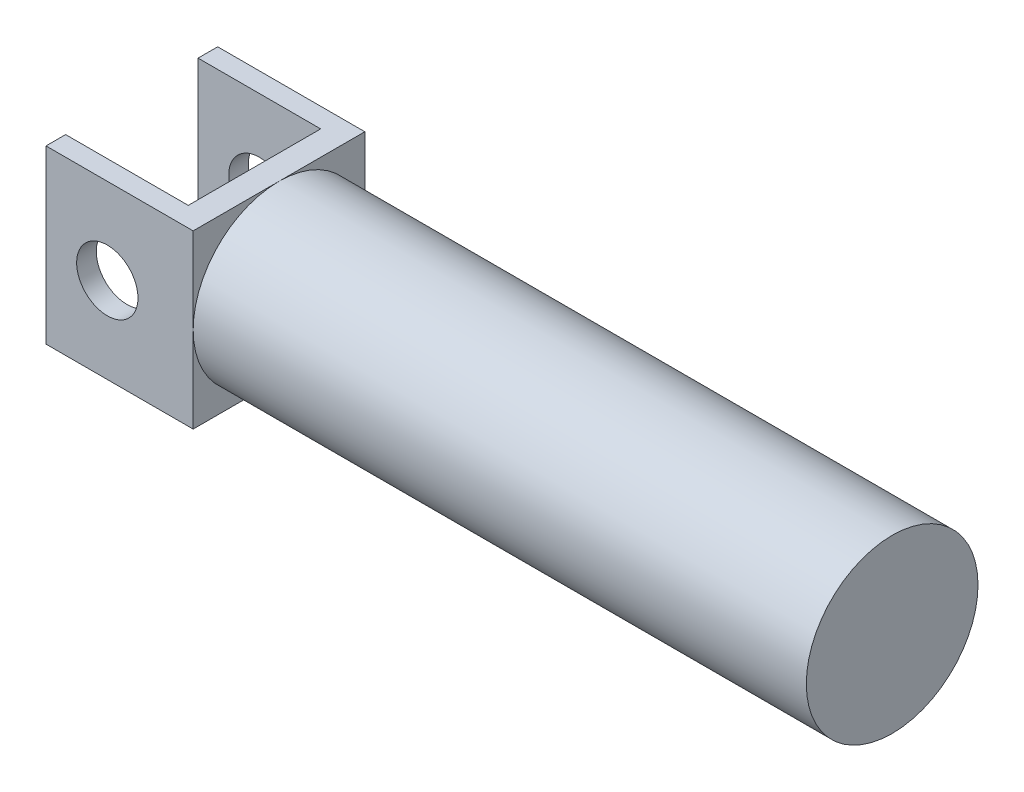
ISO-10303-21;
HEADER;
FILE_DESCRIPTION(('STEP AP214'),'2;1');
FILE_NAME('part.step','',(''),(''),'','','');
FILE_SCHEMA(('AUTOMOTIVE_DESIGN { 1 0 10303 214 1 1 1 1 }'));
ENDSEC;
DATA;
#1=APPLICATION_CONTEXT('core data for automotive mechanical design processes');
#2=APPLICATION_PROTOCOL_DEFINITION('international standard','automotive_design',2000,#1);
#3=PRODUCT_CONTEXT('',#1,'mechanical');
#4=PRODUCT('Part','Part','',(#3));
#5=PRODUCT_RELATED_PRODUCT_CATEGORY('part','',(#4));
#6=PRODUCT_DEFINITION_FORMATION('','',#4);
#7=PRODUCT_DEFINITION_CONTEXT('part definition',#1,'design');
#8=PRODUCT_DEFINITION('design','',#6,#7);
#9=PRODUCT_DEFINITION_SHAPE('','',#8);
#10=(LENGTH_UNIT() NAMED_UNIT(*) SI_UNIT(.MILLI.,.METRE.));
#11=(NAMED_UNIT(*) PLANE_ANGLE_UNIT() SI_UNIT($,.RADIAN.));
#12=(NAMED_UNIT(*) SI_UNIT($,.STERADIAN.) SOLID_ANGLE_UNIT());
#13=UNCERTAINTY_MEASURE_WITH_UNIT(LENGTH_MEASURE(1.E-05),#10,'distance_accuracy_value','');
#14=(GEOMETRIC_REPRESENTATION_CONTEXT(3) GLOBAL_UNCERTAINTY_ASSIGNED_CONTEXT((#13)) GLOBAL_UNIT_ASSIGNED_CONTEXT((#10,
#11,#12)) REPRESENTATION_CONTEXT('',''));
#15=CARTESIAN_POINT('',(0.,0.,0.));
#16=DIRECTION('',(0.,0.,1.));
#17=DIRECTION('',(1.,0.,0.));
#18=AXIS2_PLACEMENT_3D('',#15,#16,#17);
#19=CARTESIAN_POINT('',(0.,0.,0.));
#20=DIRECTION('',(1.,0.,0.));
#21=DIRECTION('',(0.,0.,-1.));
#22=AXIS2_PLACEMENT_3D('',#19,#20,#21);
#23=PLANE('',#22);
#24=DIRECTION('',(0.,-1.,0.));
#25=VECTOR('',#24,1.);
#26=CARTESIAN_POINT('',(0.,8.89000000000006,6.85799999999999));
#27=LINE('',#26,#25);
#28=CARTESIAN_POINT('',(0.,8.89000000000006,6.85799999999998));
#29=VERTEX_POINT('',#28);
#30=CARTESIAN_POINT('',(0.,-8.88999999999995,6.85799999999998));
#31=VERTEX_POINT('',#30);
#32=EDGE_CURVE('E69',#29,#31,#27,.T.);
#33=ORIENTED_EDGE('',*,*,#32,.F.);
#34=DIRECTION('',(0.,0.,1.));
#35=VECTOR('',#34,1.);
#36=CARTESIAN_POINT('',(0.,8.89000000000006,8.89000000000008));
#37=LINE('',#36,#35);
#38=CARTESIAN_POINT('',(0.,8.89000000000006,-6.85799999999999));
#39=VERTEX_POINT('',#38);
#40=EDGE_CURVE('E149',#39,#29,#37,.T.);
#41=ORIENTED_EDGE('',*,*,#40,.F.);
#42=DIRECTION('',(0.,1.,0.));
#43=VECTOR('',#42,1.);
#44=CARTESIAN_POINT('',(0.,8.89000000000006,-6.85799999999999));
#45=LINE('',#44,#43);
#46=CARTESIAN_POINT('',(0.,-8.89000000000005,-6.85799999999998));
#47=VERTEX_POINT('',#46);
#48=EDGE_CURVE('E64',#47,#39,#45,.T.);
#49=ORIENTED_EDGE('',*,*,#48,.F.);
#50=DIRECTION('',(0.,0.,-1.));
#51=VECTOR('',#50,1.);
#52=CARTESIAN_POINT('',(0.,-8.88999999999995,8.89000000000008));
#53=LINE('',#52,#51);
#54=EDGE_CURVE('E209',#31,#47,#53,.T.);
#55=ORIENTED_EDGE('',*,*,#54,.F.);
#56=EDGE_LOOP('',(#33,#41,#49,#55));
#57=FACE_BOUND('',#56,.T.);
#58=ADVANCED_FACE('F45',(#57),#23,.F.);
#59=CARTESIAN_POINT('',(2.54,0.,0.));
#60=DIRECTION('',(1.,0.,0.));
#61=DIRECTION('',(0.,0.,-1.));
#62=AXIS2_PLACEMENT_3D('',#59,#60,#61);
#63=PLANE('',#62);
#64=CARTESIAN_POINT('',(2.54,0.,0.));
#65=DIRECTION('',(1.,0.,0.));
#66=DIRECTION('',(0.,0.,-1.));
#67=AXIS2_PLACEMENT_3D('',#64,#65,#66);
#68=CIRCLE('',#67,8.89000000000001);
#69=CARTESIAN_POINT('',(2.54,0.,-8.89000000000001));
#70=VERTEX_POINT('',#69);
#71=CARTESIAN_POINT('',(2.54,8.89000000000006,0.));
#72=VERTEX_POINT('',#71);
#73=EDGE_CURVE('E57',#70,#72,#68,.T.);
#74=ORIENTED_EDGE('',*,*,#73,.F.);
#75=DIRECTION('',(0.,1.,0.));
#76=VECTOR('',#75,1.);
#77=CARTESIAN_POINT('',(2.54,-8.89000000000006,-8.88999999999992));
#78=LINE('',#77,#76);
#79=CARTESIAN_POINT('',(2.54,8.89000000000006,-8.88999999999992));
#80=VERTEX_POINT('',#79);
#81=EDGE_CURVE('E202',#70,#80,#78,.T.);
#82=ORIENTED_EDGE('',*,*,#81,.T.);
#83=DIRECTION('',(0.,0.,1.));
#84=VECTOR('',#83,1.);
#85=CARTESIAN_POINT('',(2.54,8.89000000000006,8.89000000000008));
#86=LINE('',#85,#84);
#87=EDGE_CURVE('E187',#80,#72,#86,.T.);
#88=ORIENTED_EDGE('',*,*,#87,.T.);
#89=EDGE_LOOP('',(#74,#82,#88));
#90=FACE_BOUND('',#89,.T.);
#91=ADVANCED_FACE('F247',(#90),#63,.T.);
#92=CARTESIAN_POINT('',(2.54,0.,8.89000000000008));
#93=VERTEX_POINT('',#92);
#94=EDGE_CURVE('E11',#72,#93,#68,.T.);
#95=ORIENTED_EDGE('',*,*,#94,.F.);
#96=CARTESIAN_POINT('',(2.54,8.89000000000006,8.89000000000008));
#97=VERTEX_POINT('',#96);
#98=EDGE_CURVE('E192',#72,#97,#86,.T.);
#99=ORIENTED_EDGE('',*,*,#98,.T.);
#100=DIRECTION('',(0.,-1.,0.));
#101=VECTOR('',#100,1.);
#102=CARTESIAN_POINT('',(2.54,-8.88999999999995,8.89000000000008));
#103=LINE('',#102,#101);
#104=EDGE_CURVE('E193',#97,#93,#103,.T.);
#105=ORIENTED_EDGE('',*,*,#104,.T.);
#106=EDGE_LOOP('',(#95,#99,#105));
#107=FACE_BOUND('',#106,.T.);
#108=ADVANCED_FACE('F237',(#107),#63,.T.);
#109=CARTESIAN_POINT('',(2.54,-8.89000000000001,0.));
#110=VERTEX_POINT('',#109);
#111=EDGE_CURVE('E55',#93,#110,#68,.T.);
#112=ORIENTED_EDGE('',*,*,#111,.F.);
#113=CARTESIAN_POINT('',(2.54,-8.88999999999995,8.89000000000008));
#114=VERTEX_POINT('',#113);
#115=EDGE_CURVE('E191',#93,#114,#103,.T.);
#116=ORIENTED_EDGE('',*,*,#115,.T.);
#117=DIRECTION('',(0.,0.,-1.));
#118=VECTOR('',#117,1.);
#119=CARTESIAN_POINT('',(2.54,-8.88999999999995,8.89000000000008));
#120=LINE('',#119,#118);
#121=EDGE_CURVE('E198',#114,#110,#120,.T.);
#122=ORIENTED_EDGE('',*,*,#121,.T.);
#123=EDGE_LOOP('',(#112,#116,#122));
#124=FACE_BOUND('',#123,.T.);
#125=ADVANCED_FACE('F231',(#124),#63,.T.);
#126=CARTESIAN_POINT('',(2.54,8.89000000000006,8.89000000000008));
#127=DIRECTION('',(0.,-1.,0.));
#128=DIRECTION('',(0.,0.,-1.));
#129=AXIS2_PLACEMENT_3D('',#126,#127,#128);
#130=PLANE('',#129);
#131=DIRECTION('',(-1.,0.,0.));
#132=VECTOR('',#131,1.);
#133=CARTESIAN_POINT('',(2.54,8.89000000000006,-8.88999999999992));
#134=LINE('',#133,#132);
#135=CARTESIAN_POINT('',(-12.7,8.89000000000006,-8.89000000000006));
#136=VERTEX_POINT('',#135);
#137=EDGE_CURVE('E206',#80,#136,#134,.T.);
#138=ORIENTED_EDGE('',*,*,#137,.T.);
#139=DIRECTION('',(0.,0.,-1.));
#140=VECTOR('',#139,1.);
#141=CARTESIAN_POINT('',(-12.7,8.89000000000006,-8.89000000000006));
#142=LINE('',#141,#140);
#143=CARTESIAN_POINT('',(-12.7,8.89000000000006,-6.85799999999999));
#144=VERTEX_POINT('',#143);
#145=EDGE_CURVE('E171',#144,#136,#142,.T.);
#146=ORIENTED_EDGE('',*,*,#145,.F.);
#147=DIRECTION('',(1.,0.,0.));
#148=VECTOR('',#147,1.);
#149=CARTESIAN_POINT('',(-12.7,8.89000000000006,-6.85799999999999));
#150=LINE('',#149,#148);
#151=EDGE_CURVE('E164',#144,#39,#150,.T.);
#152=ORIENTED_EDGE('',*,*,#151,.T.);
#153=ORIENTED_EDGE('',*,*,#40,.T.);
#154=DIRECTION('',(1.,0.,0.));
#155=VECTOR('',#154,1.);
#156=CARTESIAN_POINT('',(-12.7,8.89000000000006,6.85799999999999));
#157=LINE('',#156,#155);
#158=CARTESIAN_POINT('',(-12.7,8.89000000000006,6.85799999999999));
#159=VERTEX_POINT('',#158);
#160=EDGE_CURVE('E129',#159,#29,#157,.T.);
#161=ORIENTED_EDGE('',*,*,#160,.F.);
#162=DIRECTION('',(0.,0.,-1.));
#163=VECTOR('',#162,1.);
#164=CARTESIAN_POINT('',(-12.7,8.89000000000006,8.89000000000006));
#165=LINE('',#164,#163);
#166=CARTESIAN_POINT('',(-12.7,8.89000000000006,8.89000000000006));
#167=VERTEX_POINT('',#166);
#168=EDGE_CURVE('E137',#167,#159,#165,.T.);
#169=ORIENTED_EDGE('',*,*,#168,.F.);
#170=DIRECTION('',(-1.,0.,0.));
#171=VECTOR('',#170,1.);
#172=CARTESIAN_POINT('',(2.54,8.89000000000006,8.89000000000008));
#173=LINE('',#172,#171);
#174=EDGE_CURVE('E219',#97,#167,#173,.T.);
#175=ORIENTED_EDGE('',*,*,#174,.F.);
#176=ORIENTED_EDGE('',*,*,#98,.F.);
#177=ORIENTED_EDGE('',*,*,#87,.F.);
#178=EDGE_LOOP('',(#138,#146,#152,#153,#161,#169,#175,#176,#177));
#179=FACE_BOUND('',#178,.T.);
#180=ADVANCED_FACE('F47',(#179),#130,.F.);
#181=CARTESIAN_POINT('',(2.54,-8.88999999999995,8.89000000000008));
#182=DIRECTION('',(0.,0.,-1.));
#183=DIRECTION('',(-1.,0.,0.));
#184=AXIS2_PLACEMENT_3D('',#181,#182,#183);
#185=PLANE('',#184);
#186=CARTESIAN_POINT('',(-6.35,0.,8.89000000000008));
#187=DIRECTION('',(0.,0.,1.));
#188=DIRECTION('',(1.,0.,0.));
#189=AXIS2_PLACEMENT_3D('',#186,#187,#188);
#190=CIRCLE('',#189,3.175);
#191=CARTESIAN_POINT('',(-3.175,0.,8.89000000000008));
#192=VERTEX_POINT('',#191);
#193=EDGE_CURVE('E273',#192,#192,#190,.T.);
#194=ORIENTED_EDGE('',*,*,#193,.F.);
#195=EDGE_LOOP('',(#194));
#196=FACE_BOUND('',#195,.T.);
#197=ORIENTED_EDGE('',*,*,#174,.T.);
#198=DIRECTION('',(0.,1.,0.));
#199=VECTOR('',#198,1.);
#200=CARTESIAN_POINT('',(-12.7,8.89000000000006,8.89000000000006));
#201=LINE('',#200,#199);
#202=CARTESIAN_POINT('',(-12.7,-8.88999999999995,8.89000000000006));
#203=VERTEX_POINT('',#202);
#204=EDGE_CURVE('E143',#203,#167,#201,.T.);
#205=ORIENTED_EDGE('',*,*,#204,.F.);
#206=DIRECTION('',(-1.,0.,0.));
#207=VECTOR('',#206,1.);
#208=CARTESIAN_POINT('',(2.54,-8.88999999999995,8.89000000000008));
#209=LINE('',#208,#207);
#210=EDGE_CURVE('E217',#114,#203,#209,.T.);
#211=ORIENTED_EDGE('',*,*,#210,.F.);
#212=ORIENTED_EDGE('',*,*,#115,.F.);
#213=ORIENTED_EDGE('',*,*,#104,.F.);
#214=EDGE_LOOP('',(#197,#205,#211,#212,#213));
#215=FACE_BOUND('',#214,.T.);
#216=ADVANCED_FACE('F234',(#196,#215),#185,.F.);
#217=CARTESIAN_POINT('',(2.54,-8.88999999999995,8.89000000000008));
#218=DIRECTION('',(0.,1.,0.));
#219=DIRECTION('',(0.,0.,1.));
#220=AXIS2_PLACEMENT_3D('',#217,#218,#219);
#221=PLANE('',#220);
#222=ORIENTED_EDGE('',*,*,#210,.T.);
#223=DIRECTION('',(0.,0.,1.));
#224=VECTOR('',#223,1.);
#225=CARTESIAN_POINT('',(-12.7,-8.88999999999995,8.89000000000006));
#226=LINE('',#225,#224);
#227=CARTESIAN_POINT('',(-12.7,-8.88999999999995,6.85799999999998));
#228=VERTEX_POINT('',#227);
#229=EDGE_CURVE('E136',#228,#203,#226,.T.);
#230=ORIENTED_EDGE('',*,*,#229,.F.);
#231=DIRECTION('',(1.,0.,0.));
#232=VECTOR('',#231,1.);
#233=CARTESIAN_POINT('',(-12.7,-8.88999999999995,6.85799999999998));
#234=LINE('',#233,#232);
#235=EDGE_CURVE('E131',#228,#31,#234,.T.);
#236=ORIENTED_EDGE('',*,*,#235,.T.);
#237=ORIENTED_EDGE('',*,*,#54,.T.);
#238=DIRECTION('',(1.,0.,0.));
#239=VECTOR('',#238,1.);
#240=CARTESIAN_POINT('',(-12.7,-8.88999999999995,-6.85799999999998));
#241=LINE('',#240,#239);
#242=CARTESIAN_POINT('',(-12.7,-8.88999999999995,-6.85799999999998));
#243=VERTEX_POINT('',#242);
#244=EDGE_CURVE('E160',#243,#47,#241,.T.);
#245=ORIENTED_EDGE('',*,*,#244,.F.);
#246=DIRECTION('',(0.,0.,1.));
#247=VECTOR('',#246,1.);
#248=CARTESIAN_POINT('',(-12.7,-8.88999999999995,-8.89000000000006));
#249=LINE('',#248,#247);
#250=CARTESIAN_POINT('',(-12.7,-8.88999999999995,-8.89000000000006));
#251=VERTEX_POINT('',#250);
#252=EDGE_CURVE('E174',#251,#243,#249,.T.);
#253=ORIENTED_EDGE('',*,*,#252,.F.);
#254=DIRECTION('',(-1.,0.,0.));
#255=VECTOR('',#254,1.);
#256=CARTESIAN_POINT('',(2.54,-8.89000000000006,-8.88999999999992));
#257=LINE('',#256,#255);
#258=CARTESIAN_POINT('',(2.54,-8.89000000000006,-8.88999999999992));
#259=VERTEX_POINT('',#258);
#260=EDGE_CURVE('E214',#259,#251,#257,.T.);
#261=ORIENTED_EDGE('',*,*,#260,.F.);
#262=EDGE_CURVE('E197',#110,#259,#120,.T.);
#263=ORIENTED_EDGE('',*,*,#262,.F.);
#264=ORIENTED_EDGE('',*,*,#121,.F.);
#265=EDGE_LOOP('',(#222,#230,#236,#237,#245,#253,#261,#263,#264));
#266=FACE_BOUND('',#265,.T.);
#267=ADVANCED_FACE('F262',(#266),#221,.F.);
#268=CARTESIAN_POINT('',(2.54,-8.89000000000006,-8.88999999999992));
#269=DIRECTION('',(0.,0.,1.));
#270=DIRECTION('',(1.,0.,0.));
#271=AXIS2_PLACEMENT_3D('',#268,#269,#270);
#272=PLANE('',#271);
#273=CARTESIAN_POINT('',(-6.35,0.,-8.89000000000006));
#274=DIRECTION('',(0.,0.,1.));
#275=DIRECTION('',(1.,0.,0.));
#276=AXIS2_PLACEMENT_3D('',#273,#274,#275);
#277=CIRCLE('',#276,3.175);
#278=CARTESIAN_POINT('',(-3.175,0.,-8.89000000000006));
#279=VERTEX_POINT('',#278);
#280=EDGE_CURVE('E277',#279,#279,#277,.T.);
#281=ORIENTED_EDGE('',*,*,#280,.T.);
#282=EDGE_LOOP('',(#281));
#283=FACE_BOUND('',#282,.T.);
#284=ORIENTED_EDGE('',*,*,#260,.T.);
#285=DIRECTION('',(0.,-1.,0.));
#286=VECTOR('',#285,1.);
#287=CARTESIAN_POINT('',(-12.7,8.89000000000006,-8.89000000000006));
#288=LINE('',#287,#286);
#289=EDGE_CURVE('E177',#136,#251,#288,.T.);
#290=ORIENTED_EDGE('',*,*,#289,.F.);
#291=ORIENTED_EDGE('',*,*,#137,.F.);
#292=ORIENTED_EDGE('',*,*,#81,.F.);
#293=EDGE_CURVE('E203',#259,#70,#78,.T.);
#294=ORIENTED_EDGE('',*,*,#293,.F.);
#295=EDGE_LOOP('',(#284,#290,#291,#292,#294));
#296=FACE_BOUND('',#295,.T.);
#297=ADVANCED_FACE('F251',(#283,#296),#272,.F.);
#298=EDGE_CURVE('E156',#110,#70,#68,.T.);
#299=ORIENTED_EDGE('',*,*,#298,.F.);
#300=ORIENTED_EDGE('',*,*,#262,.T.);
#301=ORIENTED_EDGE('',*,*,#293,.T.);
#302=EDGE_LOOP('',(#299,#300,#301));
#303=FACE_BOUND('',#302,.T.);
#304=ADVANCED_FACE('F307',(#303),#63,.T.);
#305=CARTESIAN_POINT('',(66.04,0.,0.));
#306=DIRECTION('',(-1.,0.,0.));
#307=DIRECTION('',(0.,0.,1.));
#308=AXIS2_PLACEMENT_3D('',#305,#306,#307);
#309=CYLINDRICAL_SURFACE('',#308,8.89000000000001);
#310=CARTESIAN_POINT('',(66.04,0.,0.));
#311=DIRECTION('',(1.,0.,0.));
#312=DIRECTION('',(0.,0.,-1.));
#313=AXIS2_PLACEMENT_3D('',#310,#311,#312);
#314=CIRCLE('',#313,8.89000000000001);
#315=CARTESIAN_POINT('',(66.04,0.,-8.89000000000001));
#316=VERTEX_POINT('',#315);
#317=EDGE_CURVE('E155',#316,#316,#314,.T.);
#318=ORIENTED_EDGE('',*,*,#317,.F.);
#319=EDGE_LOOP('',(#318));
#320=FACE_BOUND('',#319,.T.);
#321=ORIENTED_EDGE('',*,*,#73,.T.);
#322=ORIENTED_EDGE('',*,*,#94,.T.);
#323=ORIENTED_EDGE('',*,*,#111,.T.);
#324=ORIENTED_EDGE('',*,*,#298,.T.);
#325=EDGE_LOOP('',(#321,#322,#323,#324));
#326=FACE_BOUND('',#325,.T.);
#327=ADVANCED_FACE('F228',(#320,#326),#309,.T.);
#328=CARTESIAN_POINT('',(66.04,0.,0.));
#329=DIRECTION('',(1.,0.,0.));
#330=DIRECTION('',(0.,0.,-1.));
#331=AXIS2_PLACEMENT_3D('',#328,#329,#330);
#332=PLANE('',#331);
#333=ORIENTED_EDGE('',*,*,#317,.T.);
#334=EDGE_LOOP('',(#333));
#335=FACE_BOUND('',#334,.T.);
#336=ADVANCED_FACE('F329',(#335),#332,.T.);
#337=CARTESIAN_POINT('',(-12.7,8.89000000000006,-6.85799999999999));
#338=DIRECTION('',(0.,0.,-1.));
#339=DIRECTION('',(0.,1.,0.));
#340=AXIS2_PLACEMENT_3D('',#337,#338,#339);
#341=PLANE('',#340);
#342=CARTESIAN_POINT('',(-6.35,0.,-6.85799999999998));
#343=DIRECTION('',(0.,0.,-1.));
#344=DIRECTION('',(0.,1.,0.));
#345=AXIS2_PLACEMENT_3D('',#342,#343,#344);
#346=CIRCLE('',#345,3.175);
#347=CARTESIAN_POINT('',(-6.35,3.175,-6.85799999999998));
#348=VERTEX_POINT('',#347);
#349=EDGE_CURVE('E165',#348,#348,#346,.T.);
#350=ORIENTED_EDGE('',*,*,#349,.T.);
#351=EDGE_LOOP('',(#350));
#352=FACE_BOUND('',#351,.T.);
#353=ORIENTED_EDGE('',*,*,#48,.T.);
#354=ORIENTED_EDGE('',*,*,#151,.F.);
#355=DIRECTION('',(0.,1.,0.));
#356=VECTOR('',#355,1.);
#357=CARTESIAN_POINT('',(-12.7,8.89000000000006,-6.85799999999999));
#358=LINE('',#357,#356);
#359=EDGE_CURVE('E168',#243,#144,#358,.T.);
#360=ORIENTED_EDGE('',*,*,#359,.F.);
#361=ORIENTED_EDGE('',*,*,#244,.T.);
#362=EDGE_LOOP('',(#353,#354,#360,#361));
#363=FACE_BOUND('',#362,.T.);
#364=ADVANCED_FACE('F260',(#352,#363),#341,.F.);
#365=CARTESIAN_POINT('',(-12.7,0.,0.));
#366=DIRECTION('',(1.,0.,0.));
#367=DIRECTION('',(0.,0.,-1.));
#368=AXIS2_PLACEMENT_3D('',#365,#366,#367);
#369=PLANE('',#368);
#370=ORIENTED_EDGE('',*,*,#145,.T.);
#371=ORIENTED_EDGE('',*,*,#289,.T.);
#372=ORIENTED_EDGE('',*,*,#252,.T.);
#373=ORIENTED_EDGE('',*,*,#359,.T.);
#374=EDGE_LOOP('',(#370,#371,#372,#373));
#375=FACE_BOUND('',#374,.T.);
#376=ADVANCED_FACE('F255',(#375),#369,.F.);
#377=CARTESIAN_POINT('',(-12.7,8.89000000000006,6.85799999999999));
#378=DIRECTION('',(0.,0.,1.));
#379=DIRECTION('',(0.,-1.,0.));
#380=AXIS2_PLACEMENT_3D('',#377,#378,#379);
#381=PLANE('',#380);
#382=CARTESIAN_POINT('',(-6.35,0.,6.85799999999998));
#383=DIRECTION('',(0.,0.,1.));
#384=DIRECTION('',(0.,-1.,0.));
#385=AXIS2_PLACEMENT_3D('',#382,#383,#384);
#386=CIRCLE('',#385,3.175);
#387=CARTESIAN_POINT('',(-6.35,-3.175,6.85799999999998));
#388=VERTEX_POINT('',#387);
#389=EDGE_CURVE('E49',#388,#388,#386,.T.);
#390=ORIENTED_EDGE('',*,*,#389,.T.);
#391=EDGE_LOOP('',(#390));
#392=FACE_BOUND('',#391,.T.);
#393=ORIENTED_EDGE('',*,*,#32,.T.);
#394=ORIENTED_EDGE('',*,*,#235,.F.);
#395=DIRECTION('',(0.,-1.,0.));
#396=VECTOR('',#395,1.);
#397=CARTESIAN_POINT('',(-12.7,8.89000000000006,6.85799999999999));
#398=LINE('',#397,#396);
#399=EDGE_CURVE('E125',#159,#228,#398,.T.);
#400=ORIENTED_EDGE('',*,*,#399,.F.);
#401=ORIENTED_EDGE('',*,*,#160,.T.);
#402=EDGE_LOOP('',(#393,#394,#400,#401));
#403=FACE_BOUND('',#402,.T.);
#404=ADVANCED_FACE('F127',(#392,#403),#381,.F.);
#405=CARTESIAN_POINT('',(-12.7,0.,0.));
#406=DIRECTION('',(-1.,0.,0.));
#407=DIRECTION('',(0.,0.,1.));
#408=AXIS2_PLACEMENT_3D('',#405,#406,#407);
#409=PLANE('',#408);
#410=ORIENTED_EDGE('',*,*,#168,.T.);
#411=ORIENTED_EDGE('',*,*,#399,.T.);
#412=ORIENTED_EDGE('',*,*,#229,.T.);
#413=ORIENTED_EDGE('',*,*,#204,.T.);
#414=EDGE_LOOP('',(#410,#411,#412,#413));
#415=FACE_BOUND('',#414,.T.);
#416=ADVANCED_FACE('F141',(#415),#409,.T.);
#417=CARTESIAN_POINT('',(-6.35,0.,-8.89000000000006));
#418=DIRECTION('',(0.,0.,1.));
#419=DIRECTION('',(1.,0.,0.));
#420=AXIS2_PLACEMENT_3D('',#417,#418,#419);
#421=CYLINDRICAL_SURFACE('',#420,3.175);
#422=ORIENTED_EDGE('',*,*,#193,.T.);
#423=EDGE_LOOP('',(#422));
#424=FACE_BOUND('',#423,.T.);
#425=ORIENTED_EDGE('',*,*,#389,.F.);
#426=EDGE_LOOP('',(#425));
#427=FACE_BOUND('',#426,.T.);
#428=ADVANCED_FACE('F287',(#424,#427),#421,.F.);
#429=ORIENTED_EDGE('',*,*,#280,.F.);
#430=EDGE_LOOP('',(#429));
#431=FACE_BOUND('',#430,.T.);
#432=ORIENTED_EDGE('',*,*,#349,.F.);
#433=EDGE_LOOP('',(#432));
#434=FACE_BOUND('',#433,.T.);
#435=ADVANCED_FACE('F289',(#431,#434),#421,.F.);
#436=CLOSED_SHELL('',(#58,#91,#108,#125,#180,#216,#267,#297,#304,#327,#336,#364,#376,#404,#416,
#428,#435));
#437=MANIFOLD_SOLID_BREP('B2',#436);
#438=ADVANCED_BREP_SHAPE_REPRESENTATION('',(#18,#437),#14);
#439=SHAPE_DEFINITION_REPRESENTATION(#9,#438);
ENDSEC;
END-ISO-10303-21;
